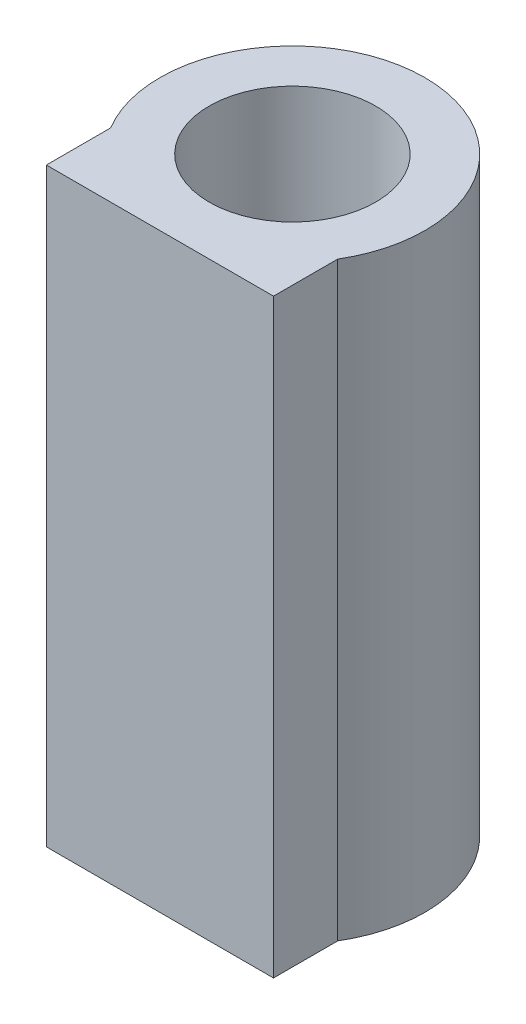
ISO-10303-21;
HEADER;
FILE_DESCRIPTION(('STEP AP214'),'2;1');
FILE_NAME('part.step','',(''),(''),'','','');
FILE_SCHEMA(('AUTOMOTIVE_DESIGN { 1 0 10303 214 1 1 1 1 }'));
ENDSEC;
DATA;
#1=APPLICATION_CONTEXT('core data for automotive mechanical design processes');
#2=APPLICATION_PROTOCOL_DEFINITION('international standard','automotive_design',2000,#1);
#3=PRODUCT_CONTEXT('',#1,'mechanical');
#4=PRODUCT('Part','Part','',(#3));
#5=PRODUCT_RELATED_PRODUCT_CATEGORY('part','',(#4));
#6=PRODUCT_DEFINITION_FORMATION('','',#4);
#7=PRODUCT_DEFINITION_CONTEXT('part definition',#1,'design');
#8=PRODUCT_DEFINITION('design','',#6,#7);
#9=PRODUCT_DEFINITION_SHAPE('','',#8);
#10=(LENGTH_UNIT() NAMED_UNIT(*) SI_UNIT(.MILLI.,.METRE.));
#11=(NAMED_UNIT(*) PLANE_ANGLE_UNIT() SI_UNIT($,.RADIAN.));
#12=(NAMED_UNIT(*) SI_UNIT($,.STERADIAN.) SOLID_ANGLE_UNIT());
#13=UNCERTAINTY_MEASURE_WITH_UNIT(LENGTH_MEASURE(1.E-05),#10,'distance_accuracy_value','');
#14=(GEOMETRIC_REPRESENTATION_CONTEXT(3) GLOBAL_UNCERTAINTY_ASSIGNED_CONTEXT((#13)) GLOBAL_UNIT_ASSIGNED_CONTEXT((#10,
#11,#12)) REPRESENTATION_CONTEXT('',''));
#15=CARTESIAN_POINT('',(0.,0.,0.));
#16=DIRECTION('',(0.,0.,1.));
#17=DIRECTION('',(1.,0.,0.));
#18=AXIS2_PLACEMENT_3D('',#15,#16,#17);
#19=CARTESIAN_POINT('',(1.5,7.8,0.));
#20=DIRECTION('',(-1.,0.,0.));
#21=DIRECTION('',(0.,0.,1.));
#22=AXIS2_PLACEMENT_3D('',#19,#20,#21);
#23=PLANE('',#22);
#24=DIRECTION('',(0.,0.,-1.));
#25=VECTOR('',#24,1.);
#26=CARTESIAN_POINT('',(1.5,0.,0.));
#27=LINE('',#26,#25);
#28=CARTESIAN_POINT('',(1.5,0.,1.75));
#29=VERTEX_POINT('',#28);
#30=CARTESIAN_POINT('',(1.5,0.,0.901387818865997));
#31=VERTEX_POINT('',#30);
#32=EDGE_CURVE('E120',#29,#31,#27,.T.);
#33=ORIENTED_EDGE('',*,*,#32,.T.);
#34=DIRECTION('',(0.,-1.,0.));
#35=VECTOR('',#34,1.);
#36=CARTESIAN_POINT('',(1.5,7.8,0.901387818865997));
#37=LINE('',#36,#35);
#38=CARTESIAN_POINT('',(1.5,7.8,0.901387818865997));
#39=VERTEX_POINT('',#38);
#40=EDGE_CURVE('E11',#39,#31,#37,.T.);
#41=ORIENTED_EDGE('',*,*,#40,.F.);
#42=DIRECTION('',(0.,0.,-1.));
#43=VECTOR('',#42,1.);
#44=CARTESIAN_POINT('',(1.5,7.8,0.));
#45=LINE('',#44,#43);
#46=CARTESIAN_POINT('',(1.5,7.8,1.75));
#47=VERTEX_POINT('',#46);
#48=EDGE_CURVE('E98',#47,#39,#45,.T.);
#49=ORIENTED_EDGE('',*,*,#48,.F.);
#50=DIRECTION('',(0.,-1.,0.));
#51=VECTOR('',#50,1.);
#52=CARTESIAN_POINT('',(1.5,7.8,1.75));
#53=LINE('',#52,#51);
#54=EDGE_CURVE('E65',#47,#29,#53,.T.);
#55=ORIENTED_EDGE('',*,*,#54,.T.);
#56=EDGE_LOOP('',(#33,#41,#49,#55));
#57=FACE_BOUND('',#56,.T.);
#58=ADVANCED_FACE('F47',(#57),#23,.F.);
#59=CARTESIAN_POINT('',(0.,7.8,0.));
#60=DIRECTION('',(0.,-1.,0.));
#61=DIRECTION('',(0.,0.,-1.));
#62=AXIS2_PLACEMENT_3D('',#59,#60,#61);
#63=CYLINDRICAL_SURFACE('',#62,1.75);
#64=CARTESIAN_POINT('',(0.,0.,0.));
#65=DIRECTION('',(0.,1.,0.));
#66=DIRECTION('',(0.,0.,1.));
#67=AXIS2_PLACEMENT_3D('',#64,#65,#66);
#68=CIRCLE('',#67,1.75);
#69=CARTESIAN_POINT('',(-1.5,0.,0.901387818865997));
#70=VERTEX_POINT('',#69);
#71=EDGE_CURVE('E104',#31,#70,#68,.T.);
#72=ORIENTED_EDGE('',*,*,#71,.T.);
#73=DIRECTION('',(0.,-1.,0.));
#74=VECTOR('',#73,1.);
#75=CARTESIAN_POINT('',(-1.5,7.8,0.901387818865997));
#76=LINE('',#75,#74);
#77=CARTESIAN_POINT('',(-1.5,7.8,0.901387818865997));
#78=VERTEX_POINT('',#77);
#79=EDGE_CURVE('E57',#78,#70,#76,.T.);
#80=ORIENTED_EDGE('',*,*,#79,.F.);
#81=CARTESIAN_POINT('',(0.,7.8,0.));
#82=DIRECTION('',(0.,1.,0.));
#83=DIRECTION('',(0.,0.,1.));
#84=AXIS2_PLACEMENT_3D('',#81,#82,#83);
#85=CIRCLE('',#84,1.75);
#86=EDGE_CURVE('E90',#39,#78,#85,.T.);
#87=ORIENTED_EDGE('',*,*,#86,.F.);
#88=ORIENTED_EDGE('',*,*,#40,.T.);
#89=EDGE_LOOP('',(#72,#80,#87,#88));
#90=FACE_BOUND('',#89,.T.);
#91=ADVANCED_FACE('F103',(#90),#63,.T.);
#92=CARTESIAN_POINT('',(-1.5,7.8,0.));
#93=DIRECTION('',(-1.,0.,0.));
#94=DIRECTION('',(0.,0.,1.));
#95=AXIS2_PLACEMENT_3D('',#92,#93,#94);
#96=PLANE('',#95);
#97=DIRECTION('',(0.,0.,-1.));
#98=VECTOR('',#97,1.);
#99=CARTESIAN_POINT('',(-1.5,0.,0.));
#100=LINE('',#99,#98);
#101=CARTESIAN_POINT('',(-1.5,0.,1.75));
#102=VERTEX_POINT('',#101);
#103=EDGE_CURVE('E125',#102,#70,#100,.T.);
#104=ORIENTED_EDGE('',*,*,#103,.F.);
#105=DIRECTION('',(0.,-1.,0.));
#106=VECTOR('',#105,1.);
#107=CARTESIAN_POINT('',(-1.5,7.8,1.75));
#108=LINE('',#107,#106);
#109=CARTESIAN_POINT('',(-1.5,7.8,1.75));
#110=VERTEX_POINT('',#109);
#111=EDGE_CURVE('E79',#110,#102,#108,.T.);
#112=ORIENTED_EDGE('',*,*,#111,.F.);
#113=DIRECTION('',(0.,0.,-1.));
#114=VECTOR('',#113,1.);
#115=CARTESIAN_POINT('',(-1.5,7.8,0.));
#116=LINE('',#115,#114);
#117=EDGE_CURVE('E97',#110,#78,#116,.T.);
#118=ORIENTED_EDGE('',*,*,#117,.T.);
#119=ORIENTED_EDGE('',*,*,#79,.T.);
#120=EDGE_LOOP('',(#104,#112,#118,#119));
#121=FACE_BOUND('',#120,.T.);
#122=ADVANCED_FACE('F108',(#121),#96,.T.);
#123=CARTESIAN_POINT('',(0.,7.8,0.));
#124=DIRECTION('',(0.,-1.,0.));
#125=DIRECTION('',(0.,0.,-1.));
#126=AXIS2_PLACEMENT_3D('',#123,#124,#125);
#127=CYLINDRICAL_SURFACE('',#126,1.1);
#128=CARTESIAN_POINT('',(0.,7.8,0.));
#129=DIRECTION('',(0.,1.,0.));
#130=DIRECTION('',(0.,0.,1.));
#131=AXIS2_PLACEMENT_3D('',#128,#129,#130);
#132=CIRCLE('',#131,1.1);
#133=CARTESIAN_POINT('',(0.,7.8,1.1));
#134=VERTEX_POINT('',#133);
#135=EDGE_CURVE('E132',#134,#134,#132,.T.);
#136=ORIENTED_EDGE('',*,*,#135,.T.);
#137=EDGE_LOOP('',(#136));
#138=FACE_BOUND('',#137,.T.);
#139=CARTESIAN_POINT('',(0.,0.,0.));
#140=DIRECTION('',(0.,1.,0.));
#141=DIRECTION('',(0.,0.,1.));
#142=AXIS2_PLACEMENT_3D('',#139,#140,#141);
#143=CIRCLE('',#142,1.1);
#144=CARTESIAN_POINT('',(0.,0.,1.1));
#145=VERTEX_POINT('',#144);
#146=EDGE_CURVE('E116',#145,#145,#143,.T.);
#147=ORIENTED_EDGE('',*,*,#146,.F.);
#148=EDGE_LOOP('',(#147));
#149=FACE_BOUND('',#148,.T.);
#150=ADVANCED_FACE('F49',(#138,#149),#127,.F.);
#151=CARTESIAN_POINT('',(0.,7.8,1.75));
#152=DIRECTION('',(0.,0.,1.));
#153=DIRECTION('',(1.,0.,0.));
#154=AXIS2_PLACEMENT_3D('',#151,#152,#153);
#155=PLANE('',#154);
#156=DIRECTION('',(-1.,0.,0.));
#157=VECTOR('',#156,1.);
#158=CARTESIAN_POINT('',(0.,0.,1.75));
#159=LINE('',#158,#157);
#160=EDGE_CURVE('E128',#29,#102,#159,.T.);
#161=ORIENTED_EDGE('',*,*,#160,.F.);
#162=ORIENTED_EDGE('',*,*,#54,.F.);
#163=DIRECTION('',(-1.,0.,0.));
#164=VECTOR('',#163,1.);
#165=CARTESIAN_POINT('',(0.,7.8,1.75));
#166=LINE('',#165,#164);
#167=EDGE_CURVE('E110',#47,#110,#166,.T.);
#168=ORIENTED_EDGE('',*,*,#167,.T.);
#169=ORIENTED_EDGE('',*,*,#111,.T.);
#170=EDGE_LOOP('',(#161,#162,#168,#169));
#171=FACE_BOUND('',#170,.T.);
#172=ADVANCED_FACE('F147',(#171),#155,.T.);
#173=CARTESIAN_POINT('',(0.,7.8,0.));
#174=DIRECTION('',(0.,1.,0.));
#175=DIRECTION('',(0.,0.,1.));
#176=AXIS2_PLACEMENT_3D('',#173,#174,#175);
#177=PLANE('',#176);
#178=ORIENTED_EDGE('',*,*,#135,.F.);
#179=EDGE_LOOP('',(#178));
#180=FACE_BOUND('',#179,.T.);
#181=ORIENTED_EDGE('',*,*,#48,.T.);
#182=ORIENTED_EDGE('',*,*,#86,.T.);
#183=ORIENTED_EDGE('',*,*,#117,.F.);
#184=ORIENTED_EDGE('',*,*,#167,.F.);
#185=EDGE_LOOP('',(#181,#182,#183,#184));
#186=FACE_BOUND('',#185,.T.);
#187=ADVANCED_FACE('F94',(#180,#186),#177,.T.);
#188=CARTESIAN_POINT('',(0.,0.,0.));
#189=DIRECTION('',(0.,1.,0.));
#190=DIRECTION('',(0.,0.,1.));
#191=AXIS2_PLACEMENT_3D('',#188,#189,#190);
#192=PLANE('',#191);
#193=ORIENTED_EDGE('',*,*,#146,.T.);
#194=EDGE_LOOP('',(#193));
#195=FACE_BOUND('',#194,.T.);
#196=ORIENTED_EDGE('',*,*,#32,.F.);
#197=ORIENTED_EDGE('',*,*,#160,.T.);
#198=ORIENTED_EDGE('',*,*,#103,.T.);
#199=ORIENTED_EDGE('',*,*,#71,.F.);
#200=EDGE_LOOP('',(#196,#197,#198,#199));
#201=FACE_BOUND('',#200,.T.);
#202=ADVANCED_FACE('F146',(#195,#201),#192,.F.);
#203=CLOSED_SHELL('',(#58,#91,#122,#150,#172,#187,#202));
#204=MANIFOLD_SOLID_BREP('B2',#203);
#205=ADVANCED_BREP_SHAPE_REPRESENTATION('',(#18,#204),#14);
#206=SHAPE_DEFINITION_REPRESENTATION(#9,#205);
ENDSEC;
END-ISO-10303-21;
